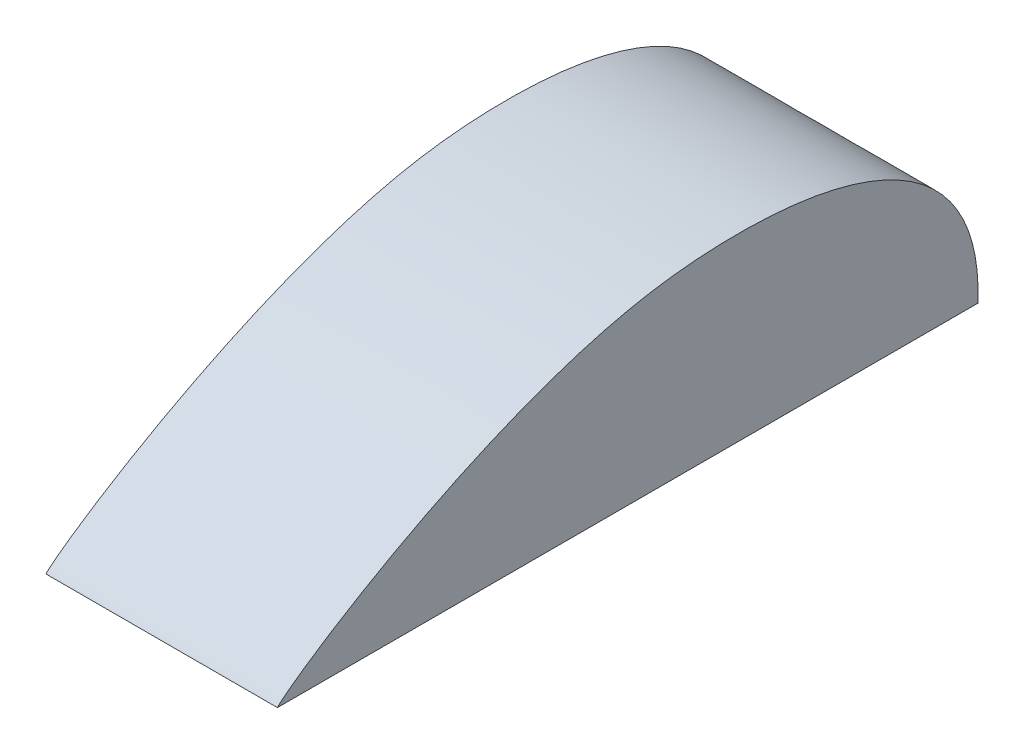
ISO-10303-21;
HEADER;
FILE_DESCRIPTION(('STEP AP214'),'2;1');
FILE_NAME('part.step','',(''),(''),'','','');
FILE_SCHEMA(('AUTOMOTIVE_DESIGN { 1 0 10303 214 1 1 1 1 }'));
ENDSEC;
DATA;
#1=APPLICATION_CONTEXT('core data for automotive mechanical design processes');
#2=APPLICATION_PROTOCOL_DEFINITION('international standard','automotive_design',2000,#1);
#3=PRODUCT_CONTEXT('',#1,'mechanical');
#4=PRODUCT('Part','Part','',(#3));
#5=PRODUCT_RELATED_PRODUCT_CATEGORY('part','',(#4));
#6=PRODUCT_DEFINITION_FORMATION('','',#4);
#7=PRODUCT_DEFINITION_CONTEXT('part definition',#1,'design');
#8=PRODUCT_DEFINITION('design','',#6,#7);
#9=PRODUCT_DEFINITION_SHAPE('','',#8);
#10=(LENGTH_UNIT() NAMED_UNIT(*) SI_UNIT(.MILLI.,.METRE.));
#11=(NAMED_UNIT(*) PLANE_ANGLE_UNIT() SI_UNIT($,.RADIAN.));
#12=(NAMED_UNIT(*) SI_UNIT($,.STERADIAN.) SOLID_ANGLE_UNIT());
#13=UNCERTAINTY_MEASURE_WITH_UNIT(LENGTH_MEASURE(1.E-05),#10,'distance_accuracy_value','');
#14=(GEOMETRIC_REPRESENTATION_CONTEXT(3) GLOBAL_UNCERTAINTY_ASSIGNED_CONTEXT((#13)) GLOBAL_UNIT_ASSIGNED_CONTEXT((#10,
#11,#12)) REPRESENTATION_CONTEXT('',''));
#15=CARTESIAN_POINT('',(0.,0.,0.));
#16=DIRECTION('',(0.,0.,1.));
#17=DIRECTION('',(1.,0.,0.));
#18=AXIS2_PLACEMENT_3D('',#15,#16,#17);
#19=CARTESIAN_POINT('',(46.99,0.,-142.24));
#20=CARTESIAN_POINT('',(46.99,56.5904823237367,-144.250976283753));
#21=CARTESIAN_POINT('',(46.99,78.19839531152,-83.4190797832683));
#22=CARTESIAN_POINT('',(46.99,65.1397356684952,50.6708811716759));
#23=CARTESIAN_POINT('',(46.99,5.37480225356978,138.322604019124));
#24=CARTESIAN_POINT('',(46.99,0.,142.24));
#25=B_SPLINE_CURVE_WITH_KNOTS('',3,(#19,#20,#21,#22,#23,#24),.UNSPECIFIED.,.F.,.F.,(4,1,1,4),
(0.,0.415672110899323,0.502688643915337,1.),.UNSPECIFIED.);
#26=DIRECTION('',(-1.,0.,0.));
#27=VECTOR('',#26,1.);
#28=SURFACE_OF_LINEAR_EXTRUSION('',#25,#27);
#29=CARTESIAN_POINT('',(-46.99,0.,-142.24));
#30=CARTESIAN_POINT('',(-46.99,56.5904823237367,-144.250976283753));
#31=CARTESIAN_POINT('',(-46.99,78.19839531152,-83.4190797832683));
#32=CARTESIAN_POINT('',(-46.99,65.1397356684952,50.6708811716759));
#33=CARTESIAN_POINT('',(-46.99,5.37480225356978,138.322604019124));
#34=CARTESIAN_POINT('',(-46.99,0.,142.24));
#35=B_SPLINE_CURVE_WITH_KNOTS('',3,(#29,#30,#31,#32,#33,#34),.UNSPECIFIED.,.F.,.F.,(4,1,1,4),
(0.,0.415672110899323,0.502688643915337,1.),.UNSPECIFIED.);
#36=CARTESIAN_POINT('',(-46.99,0.,-142.24));
#37=VERTEX_POINT('',#36);
#38=CARTESIAN_POINT('',(-46.99,0.,142.24));
#39=VERTEX_POINT('',#38);
#40=EDGE_CURVE('E69',#37,#39,#35,.T.);
#41=ORIENTED_EDGE('',*,*,#40,.T.);
#42=DIRECTION('',(-1.,0.,0.));
#43=VECTOR('',#42,1.);
#44=CARTESIAN_POINT('',(46.99,0.,142.24));
#45=LINE('',#44,#43);
#46=CARTESIAN_POINT('',(46.99,0.,142.24));
#47=VERTEX_POINT('',#46);
#48=EDGE_CURVE('E11',#47,#39,#45,.T.);
#49=ORIENTED_EDGE('',*,*,#48,.F.);
#50=CARTESIAN_POINT('',(46.99,0.,-142.24));
#51=VERTEX_POINT('',#50);
#52=EDGE_CURVE('E68',#51,#47,#25,.T.);
#53=ORIENTED_EDGE('',*,*,#52,.F.);
#54=DIRECTION('',(-1.,0.,0.));
#55=VECTOR('',#54,1.);
#56=CARTESIAN_POINT('',(46.99,0.,-142.24));
#57=LINE('',#56,#55);
#58=EDGE_CURVE('E46',#51,#37,#57,.T.);
#59=ORIENTED_EDGE('',*,*,#58,.T.);
#60=EDGE_LOOP('',(#41,#49,#53,#59));
#61=FACE_BOUND('',#60,.T.);
#62=ADVANCED_FACE('F37',(#61),#28,.F.);
#63=CARTESIAN_POINT('',(46.99,0.,142.24));
#64=DIRECTION('',(0.,1.,0.));
#65=DIRECTION('',(0.,0.,1.));
#66=AXIS2_PLACEMENT_3D('',#63,#64,#65);
#67=PLANE('',#66);
#68=DIRECTION('',(0.,0.,-1.));
#69=VECTOR('',#68,1.);
#70=CARTESIAN_POINT('',(-46.99,0.,142.24));
#71=LINE('',#70,#69);
#72=EDGE_CURVE('E61',#39,#37,#71,.T.);
#73=ORIENTED_EDGE('',*,*,#72,.T.);
#74=ORIENTED_EDGE('',*,*,#58,.F.);
#75=DIRECTION('',(0.,0.,-1.));
#76=VECTOR('',#75,1.);
#77=CARTESIAN_POINT('',(46.99,0.,142.24));
#78=LINE('',#77,#76);
#79=EDGE_CURVE('E53',#47,#51,#78,.T.);
#80=ORIENTED_EDGE('',*,*,#79,.F.);
#81=ORIENTED_EDGE('',*,*,#48,.T.);
#82=EDGE_LOOP('',(#73,#74,#80,#81));
#83=FACE_BOUND('',#82,.T.);
#84=ADVANCED_FACE('F64',(#83),#67,.F.);
#85=CARTESIAN_POINT('',(46.99,69.5506815860907,-5.23939855723026));
#86=DIRECTION('',(1.,0.,0.));
#87=DIRECTION('',(0.,0.,-1.));
#88=AXIS2_PLACEMENT_3D('',#85,#86,#87);
#89=PLANE('',#88);
#90=ORIENTED_EDGE('',*,*,#52,.T.);
#91=ORIENTED_EDGE('',*,*,#79,.T.);
#92=EDGE_LOOP('',(#90,#91));
#93=FACE_BOUND('',#92,.T.);
#94=ADVANCED_FACE('F86',(#93),#89,.T.);
#95=CARTESIAN_POINT('',(-46.99,69.5506815860907,-5.23939855723026));
#96=DIRECTION('',(1.,0.,0.));
#97=DIRECTION('',(0.,0.,-1.));
#98=AXIS2_PLACEMENT_3D('',#95,#96,#97);
#99=PLANE('',#98);
#100=ORIENTED_EDGE('',*,*,#40,.F.);
#101=ORIENTED_EDGE('',*,*,#72,.F.);
#102=EDGE_LOOP('',(#100,#101));
#103=FACE_BOUND('',#102,.T.);
#104=ADVANCED_FACE('F72',(#103),#99,.F.);
#105=CLOSED_SHELL('',(#62,#84,#94,#104));
#106=MANIFOLD_SOLID_BREP('B2',#105);
#107=ADVANCED_BREP_SHAPE_REPRESENTATION('',(#18,#106),#14);
#108=SHAPE_DEFINITION_REPRESENTATION(#9,#107);
ENDSEC;
END-ISO-10303-21;
